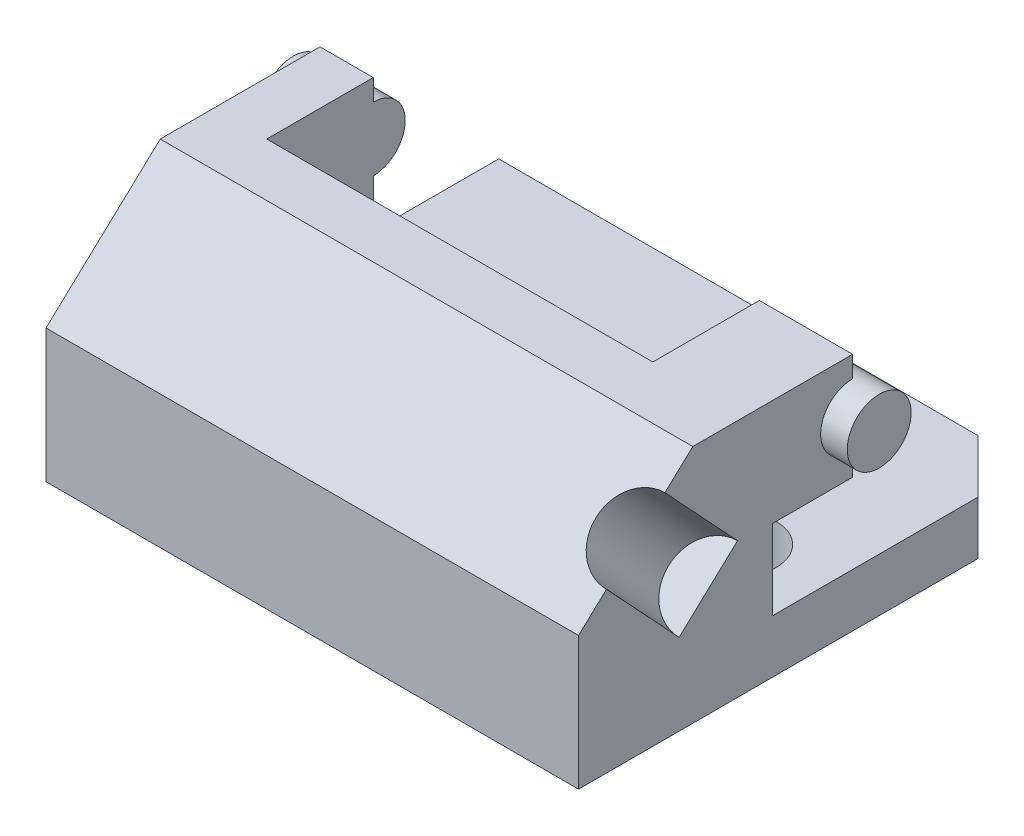
ISO-10303-21;
HEADER;
FILE_DESCRIPTION(('STEP AP214'),'2;1');
FILE_NAME('part.step','',(''),(''),'','','');
FILE_SCHEMA(('AUTOMOTIVE_DESIGN { 1 0 10303 214 1 1 1 1 }'));
ENDSEC;
DATA;
#1=APPLICATION_CONTEXT('core data for automotive mechanical design processes');
#2=APPLICATION_PROTOCOL_DEFINITION('international standard','automotive_design',2000,#1);
#3=PRODUCT_CONTEXT('',#1,'mechanical');
#4=PRODUCT('Part','Part','',(#3));
#5=PRODUCT_RELATED_PRODUCT_CATEGORY('part','',(#4));
#6=PRODUCT_DEFINITION_FORMATION('','',#4);
#7=PRODUCT_DEFINITION_CONTEXT('part definition',#1,'design');
#8=PRODUCT_DEFINITION('design','',#6,#7);
#9=PRODUCT_DEFINITION_SHAPE('','',#8);
#10=(LENGTH_UNIT() NAMED_UNIT(*) SI_UNIT(.MILLI.,.METRE.));
#11=(NAMED_UNIT(*) PLANE_ANGLE_UNIT() SI_UNIT($,.RADIAN.));
#12=(NAMED_UNIT(*) SI_UNIT($,.STERADIAN.) SOLID_ANGLE_UNIT());
#13=UNCERTAINTY_MEASURE_WITH_UNIT(LENGTH_MEASURE(1.E-05),#10,'distance_accuracy_value','');
#14=(GEOMETRIC_REPRESENTATION_CONTEXT(3) GLOBAL_UNCERTAINTY_ASSIGNED_CONTEXT((#13)) GLOBAL_UNIT_ASSIGNED_CONTEXT((#10,
#11,#12)) REPRESENTATION_CONTEXT('',''));
#15=CARTESIAN_POINT('',(0.,0.,0.));
#16=DIRECTION('',(0.,0.,1.));
#17=DIRECTION('',(1.,0.,0.));
#18=AXIS2_PLACEMENT_3D('',#15,#16,#17);
#19=CARTESIAN_POINT('',(100.,25.,-15.));
#20=DIRECTION('',(-1.,0.,0.));
#21=DIRECTION('',(0.,0.,1.));
#22=AXIS2_PLACEMENT_3D('',#19,#20,#21);
#23=CYLINDRICAL_SURFACE('',#22,6.);
#24=CARTESIAN_POINT('',(105.,25.,-15.));
#25=DIRECTION('',(1.,0.,0.));
#26=DIRECTION('',(0.,0.,-1.));
#27=AXIS2_PLACEMENT_3D('',#24,#25,#26);
#28=CIRCLE('',#27,6.00000000000001);
#29=CARTESIAN_POINT('',(105.,25.,-21.));
#30=VERTEX_POINT('',#29);
#31=EDGE_CURVE('E275',#30,#30,#28,.T.);
#32=ORIENTED_EDGE('',*,*,#31,.F.);
#33=EDGE_LOOP('',(#32));
#34=FACE_BOUND('',#33,.T.);
#35=CARTESIAN_POINT('',(82.5,25.,-15.));
#36=DIRECTION('',(-1.,0.,0.));
#37=DIRECTION('',(0.,0.,1.));
#38=AXIS2_PLACEMENT_3D('',#35,#36,#37);
#39=CIRCLE('',#38,6.);
#40=CARTESIAN_POINT('',(82.5,31.,-15.));
#41=VERTEX_POINT('',#40);
#42=CARTESIAN_POINT('',(82.5,19.,-15.));
#43=VERTEX_POINT('',#42);
#44=EDGE_CURVE('E484',#41,#43,#39,.T.);
#45=ORIENTED_EDGE('',*,*,#44,.F.);
#46=DIRECTION('',(-1.,0.,0.));
#47=VECTOR('',#46,1.);
#48=CARTESIAN_POINT('',(100.,31.,-15.));
#49=LINE('',#48,#47);
#50=CARTESIAN_POINT('',(100.,31.,-15.));
#51=VERTEX_POINT('',#50);
#52=EDGE_CURVE('E254',#51,#41,#49,.T.);
#53=ORIENTED_EDGE('',*,*,#52,.F.);
#54=CARTESIAN_POINT('',(100.,25.,-15.));
#55=DIRECTION('',(1.,0.,0.));
#56=DIRECTION('',(0.,0.,-1.));
#57=AXIS2_PLACEMENT_3D('',#54,#55,#56);
#58=CIRCLE('',#57,6.00000000000001);
#59=CARTESIAN_POINT('',(100.,19.,-15.));
#60=VERTEX_POINT('',#59);
#61=EDGE_CURVE('E279',#51,#60,#58,.T.);
#62=ORIENTED_EDGE('',*,*,#61,.T.);
#63=DIRECTION('',(-1.,0.,0.));
#64=VECTOR('',#63,1.);
#65=CARTESIAN_POINT('',(100.,19.,-15.));
#66=LINE('',#65,#64);
#67=EDGE_CURVE('E258',#60,#43,#66,.T.);
#68=ORIENTED_EDGE('',*,*,#67,.T.);
#69=EDGE_LOOP('',(#45,#53,#62,#68));
#70=FACE_BOUND('',#69,.T.);
#71=ADVANCED_FACE('F39',(#34,#70),#23,.T.);
#72=CARTESIAN_POINT('',(-5.,25.,-15.));
#73=DIRECTION('',(-1.,0.,0.));
#74=DIRECTION('',(0.,0.,1.));
#75=AXIS2_PLACEMENT_3D('',#72,#73,#74);
#76=CIRCLE('',#75,6.00000000000001);
#77=CARTESIAN_POINT('',(-5.,25.,-8.99999999999999));
#78=VERTEX_POINT('',#77);
#79=EDGE_CURVE('E273',#78,#78,#76,.T.);
#80=ORIENTED_EDGE('',*,*,#79,.F.);
#81=EDGE_LOOP('',(#80));
#82=FACE_BOUND('',#81,.T.);
#83=CARTESIAN_POINT('',(9.99999999999999,25.,-15.));
#84=DIRECTION('',(1.,0.,0.));
#85=DIRECTION('',(0.,0.,-1.));
#86=AXIS2_PLACEMENT_3D('',#83,#84,#85);
#87=CIRCLE('',#86,6.);
#88=CARTESIAN_POINT('',(10.,19.,-15.));
#89=VERTEX_POINT('',#88);
#90=CARTESIAN_POINT('',(10.,31.,-15.));
#91=VERTEX_POINT('',#90);
#92=EDGE_CURVE('E482',#89,#91,#87,.T.);
#93=ORIENTED_EDGE('',*,*,#92,.F.);
#94=CARTESIAN_POINT('',(0.,19.,-15.));
#95=VERTEX_POINT('',#94);
#96=EDGE_CURVE('E257',#89,#95,#66,.T.);
#97=ORIENTED_EDGE('',*,*,#96,.T.);
#98=CARTESIAN_POINT('',(0.,25.,-15.));
#99=DIRECTION('',(-1.,0.,0.));
#100=DIRECTION('',(0.,0.,1.));
#101=AXIS2_PLACEMENT_3D('',#98,#99,#100);
#102=CIRCLE('',#101,6.00000000000001);
#103=CARTESIAN_POINT('',(0.,31.,-15.));
#104=VERTEX_POINT('',#103);
#105=EDGE_CURVE('E260',#95,#104,#102,.T.);
#106=ORIENTED_EDGE('',*,*,#105,.T.);
#107=EDGE_CURVE('E253',#91,#104,#49,.T.);
#108=ORIENTED_EDGE('',*,*,#107,.F.);
#109=EDGE_LOOP('',(#93,#97,#106,#108));
#110=FACE_BOUND('',#109,.T.);
#111=ADVANCED_FACE('F433',(#82,#110),#23,.T.);
#112=CARTESIAN_POINT('',(100.,0.,-15.));
#113=DIRECTION('',(0.,0.,1.));
#114=DIRECTION('',(0.,-1.,0.));
#115=AXIS2_PLACEMENT_3D('',#112,#113,#114);
#116=PLANE('',#115);
#117=ORIENTED_EDGE('',*,*,#96,.F.);
#118=DIRECTION('',(0.,1.,0.));
#119=VECTOR('',#118,1.);
#120=CARTESIAN_POINT('',(10.,-75.2080447824566,-15.));
#121=LINE('',#120,#119);
#122=CARTESIAN_POINT('',(10.,15.,-15.));
#123=VERTEX_POINT('',#122);
#124=EDGE_CURVE('E354',#123,#89,#121,.T.);
#125=ORIENTED_EDGE('',*,*,#124,.F.);
#126=DIRECTION('',(-1.,0.,0.));
#127=VECTOR('',#126,1.);
#128=CARTESIAN_POINT('',(100.,15.,-15.));
#129=LINE('',#128,#127);
#130=CARTESIAN_POINT('',(0.,15.,-15.));
#131=VERTEX_POINT('',#130);
#132=EDGE_CURVE('E304',#123,#131,#129,.T.);
#133=ORIENTED_EDGE('',*,*,#132,.T.);
#134=DIRECTION('',(0.,1.,0.));
#135=VECTOR('',#134,1.);
#136=CARTESIAN_POINT('',(0.,0.,-15.));
#137=LINE('',#136,#135);
#138=EDGE_CURVE('E278',#131,#95,#137,.T.);
#139=ORIENTED_EDGE('',*,*,#138,.T.);
#140=EDGE_LOOP('',(#117,#125,#133,#139));
#141=FACE_BOUND('',#140,.T.);
#142=ADVANCED_FACE('F351',(#141),#116,.F.);
#143=CARTESIAN_POINT('',(100.,0.,-15.));
#144=DIRECTION('',(0.,0.,1.));
#145=DIRECTION('',(0.,-1.,0.));
#146=AXIS2_PLACEMENT_3D('',#143,#144,#145);
#147=PLANE('',#146);
#148=DIRECTION('',(-1.,0.,0.));
#149=VECTOR('',#148,1.);
#150=CARTESIAN_POINT('',(100.,35.,-15.));
#151=LINE('',#150,#149);
#152=CARTESIAN_POINT('',(10.,35.,-15.));
#153=VERTEX_POINT('',#152);
#154=CARTESIAN_POINT('',(0.,35.,-15.));
#155=VERTEX_POINT('',#154);
#156=EDGE_CURVE('E249',#153,#155,#151,.T.);
#157=ORIENTED_EDGE('',*,*,#156,.F.);
#158=EDGE_CURVE('E357',#91,#153,#121,.T.);
#159=ORIENTED_EDGE('',*,*,#158,.F.);
#160=ORIENTED_EDGE('',*,*,#107,.T.);
#161=DIRECTION('',(0.,1.,0.));
#162=VECTOR('',#161,1.);
#163=CARTESIAN_POINT('',(0.,0.,-15.));
#164=LINE('',#163,#162);
#165=EDGE_CURVE('E307',#104,#155,#164,.T.);
#166=ORIENTED_EDGE('',*,*,#165,.T.);
#167=EDGE_LOOP('',(#157,#159,#160,#166));
#168=FACE_BOUND('',#167,.T.);
#169=ADVANCED_FACE('F446',(#168),#147,.F.);
#170=CARTESIAN_POINT('',(100.,0.,0.));
#171=DIRECTION('',(0.,0.,1.));
#172=DIRECTION('',(1.,0.,0.));
#173=AXIS2_PLACEMENT_3D('',#170,#171,#172);
#174=PLANE('',#173);
#175=DIRECTION('',(-1.,0.,0.));
#176=VECTOR('',#175,1.);
#177=CARTESIAN_POINT('',(100.,15.,0.));
#178=LINE('',#177,#176);
#179=CARTESIAN_POINT('',(10.,15.,0.));
#180=VERTEX_POINT('',#179);
#181=CARTESIAN_POINT('',(0.,15.,0.));
#182=VERTEX_POINT('',#181);
#183=EDGE_CURVE('E331',#180,#182,#178,.T.);
#184=ORIENTED_EDGE('',*,*,#183,.F.);
#185=DIRECTION('',(0.,-1.,0.));
#186=VECTOR('',#185,1.);
#187=CARTESIAN_POINT('',(10.,0.,0.));
#188=LINE('',#187,#186);
#189=CARTESIAN_POINT('',(10.,0.,0.));
#190=VERTEX_POINT('',#189);
#191=EDGE_CURVE('E377',#180,#190,#188,.T.);
#192=ORIENTED_EDGE('',*,*,#191,.T.);
#193=DIRECTION('',(-1.,0.,0.));
#194=VECTOR('',#193,1.);
#195=CARTESIAN_POINT('',(100.,0.,0.));
#196=LINE('',#195,#194);
#197=CARTESIAN_POINT('',(0.,0.,0.));
#198=VERTEX_POINT('',#197);
#199=EDGE_CURVE('E240',#190,#198,#196,.T.);
#200=ORIENTED_EDGE('',*,*,#199,.T.);
#201=DIRECTION('',(0.,1.,0.));
#202=VECTOR('',#201,1.);
#203=CARTESIAN_POINT('',(0.,0.,0.));
#204=LINE('',#203,#202);
#205=EDGE_CURVE('E325',#198,#182,#204,.T.);
#206=ORIENTED_EDGE('',*,*,#205,.T.);
#207=EDGE_LOOP('',(#184,#192,#200,#206));
#208=FACE_BOUND('',#207,.T.);
#209=ADVANCED_FACE('F344',(#208),#174,.F.);
#210=CARTESIAN_POINT('',(100.,15.,0.));
#211=DIRECTION('',(0.,1.,0.));
#212=DIRECTION('',(0.,0.,1.));
#213=AXIS2_PLACEMENT_3D('',#210,#211,#212);
#214=PLANE('',#213);
#215=ORIENTED_EDGE('',*,*,#132,.F.);
#216=DIRECTION('',(0.,0.,1.));
#217=VECTOR('',#216,1.);
#218=CARTESIAN_POINT('',(10.,15.,0.));
#219=LINE('',#218,#217);
#220=EDGE_CURVE('E11',#123,#180,#219,.T.);
#221=ORIENTED_EDGE('',*,*,#220,.T.);
#222=ORIENTED_EDGE('',*,*,#183,.T.);
#223=DIRECTION('',(0.,0.,-1.));
#224=VECTOR('',#223,1.);
#225=CARTESIAN_POINT('',(0.,15.,0.));
#226=LINE('',#225,#224);
#227=EDGE_CURVE('E285',#182,#131,#226,.T.);
#228=ORIENTED_EDGE('',*,*,#227,.T.);
#229=EDGE_LOOP('',(#215,#221,#222,#228));
#230=FACE_BOUND('',#229,.T.);
#231=ADVANCED_FACE('F338',(#230),#214,.F.);
#232=CARTESIAN_POINT('',(100.,15.,-15.));
#233=VERTEX_POINT('',#232);
#234=CARTESIAN_POINT('',(82.5,15.,-15.));
#235=VERTEX_POINT('',#234);
#236=EDGE_CURVE('E330',#233,#235,#129,.T.);
#237=ORIENTED_EDGE('',*,*,#236,.T.);
#238=DIRECTION('',(0.,1.,0.));
#239=VECTOR('',#238,1.);
#240=CARTESIAN_POINT('',(82.5,-75.2080447824566,-15.));
#241=LINE('',#240,#239);
#242=EDGE_CURVE('E361',#235,#43,#241,.T.);
#243=ORIENTED_EDGE('',*,*,#242,.T.);
#244=ORIENTED_EDGE('',*,*,#67,.F.);
#245=DIRECTION('',(0.,1.,0.));
#246=VECTOR('',#245,1.);
#247=CARTESIAN_POINT('',(100.,0.,-15.));
#248=LINE('',#247,#246);
#249=EDGE_CURVE('E282',#233,#60,#248,.T.);
#250=ORIENTED_EDGE('',*,*,#249,.F.);
#251=EDGE_LOOP('',(#237,#243,#244,#250));
#252=FACE_BOUND('',#251,.T.);
#253=ADVANCED_FACE('F41',(#252),#116,.F.);
#254=ORIENTED_EDGE('',*,*,#52,.T.);
#255=CARTESIAN_POINT('',(82.5,35.,-15.));
#256=VERTEX_POINT('',#255);
#257=EDGE_CURVE('E364',#41,#256,#241,.T.);
#258=ORIENTED_EDGE('',*,*,#257,.T.);
#259=CARTESIAN_POINT('',(100.,35.,-15.));
#260=VERTEX_POINT('',#259);
#261=EDGE_CURVE('E250',#260,#256,#151,.T.);
#262=ORIENTED_EDGE('',*,*,#261,.F.);
#263=DIRECTION('',(0.,1.,0.));
#264=VECTOR('',#263,1.);
#265=CARTESIAN_POINT('',(100.,0.,-15.));
#266=LINE('',#265,#264);
#267=EDGE_CURVE('E284',#51,#260,#266,.T.);
#268=ORIENTED_EDGE('',*,*,#267,.F.);
#269=EDGE_LOOP('',(#254,#258,#262,#268));
#270=FACE_BOUND('',#269,.T.);
#271=ADVANCED_FACE('F442',(#270),#147,.F.);
#272=CARTESIAN_POINT('',(100.,35.,0.));
#273=DIRECTION('',(0.,1.,0.));
#274=DIRECTION('',(0.,0.,1.));
#275=AXIS2_PLACEMENT_3D('',#272,#273,#274);
#276=PLANE('',#275);
#277=DIRECTION('',(0.,0.,1.));
#278=VECTOR('',#277,1.);
#279=CARTESIAN_POINT('',(10.,35.,0.));
#280=LINE('',#279,#278);
#281=CARTESIAN_POINT('',(10.,35.,5.00000000000001));
#282=VERTEX_POINT('',#281);
#283=EDGE_CURVE('E370',#153,#282,#280,.T.);
#284=ORIENTED_EDGE('',*,*,#283,.F.);
#285=ORIENTED_EDGE('',*,*,#156,.T.);
#286=DIRECTION('',(0.,0.,-1.));
#287=VECTOR('',#286,1.);
#288=CARTESIAN_POINT('',(0.,35.,0.));
#289=LINE('',#288,#287);
#290=CARTESIAN_POINT('',(0.,35.,15.));
#291=VERTEX_POINT('',#290);
#292=EDGE_CURVE('E310',#291,#155,#289,.T.);
#293=ORIENTED_EDGE('',*,*,#292,.F.);
#294=DIRECTION('',(-1.,0.,0.));
#295=VECTOR('',#294,1.);
#296=CARTESIAN_POINT('',(100.,35.,15.));
#297=LINE('',#296,#295);
#298=CARTESIAN_POINT('',(100.,35.,15.));
#299=VERTEX_POINT('',#298);
#300=EDGE_CURVE('E247',#299,#291,#297,.T.);
#301=ORIENTED_EDGE('',*,*,#300,.F.);
#302=DIRECTION('',(0.,0.,-1.));
#303=VECTOR('',#302,1.);
#304=CARTESIAN_POINT('',(100.,35.,0.));
#305=LINE('',#304,#303);
#306=EDGE_CURVE('E287',#299,#260,#305,.T.);
#307=ORIENTED_EDGE('',*,*,#306,.T.);
#308=ORIENTED_EDGE('',*,*,#261,.T.);
#309=DIRECTION('',(0.,0.,-1.));
#310=VECTOR('',#309,1.);
#311=CARTESIAN_POINT('',(82.5,35.,0.));
#312=LINE('',#311,#310);
#313=CARTESIAN_POINT('',(82.5,35.,5.00000000000001));
#314=VERTEX_POINT('',#313);
#315=EDGE_CURVE('E498',#314,#256,#312,.T.);
#316=ORIENTED_EDGE('',*,*,#315,.F.);
#317=DIRECTION('',(1.,0.,0.));
#318=VECTOR('',#317,1.);
#319=CARTESIAN_POINT('',(0.,35.,5.00000000000001));
#320=LINE('',#319,#318);
#321=EDGE_CURVE('E487',#282,#314,#320,.T.);
#322=ORIENTED_EDGE('',*,*,#321,.F.);
#323=EDGE_LOOP('',(#284,#285,#293,#301,#307,#308,#316,#322));
#324=FACE_BOUND('',#323,.T.);
#325=ADVANCED_FACE('F407',(#324),#276,.T.);
#326=CARTESIAN_POINT('',(100.,26.2024686674709,24.434197326466));
#327=DIRECTION('',(0.,0.731353701619172,0.681998360062497));
#328=DIRECTION('',(0.,-0.681998360062497,0.731353701619172));
#329=AXIS2_PLACEMENT_3D('',#326,#327,#328);
#330=PLANE('',#329);
#331=CARTESIAN_POINT('',(100.,25.,25.7236871002469));
#332=DIRECTION('',(0.,0.731353701619172,0.681998360062497));
#333=DIRECTION('',(0.,-0.681998360062497,0.731353701619172));
#334=AXIS2_PLACEMENT_3D('',#331,#332,#333);
#335=CIRCLE('',#334,7.50000000000001);
#336=CARTESIAN_POINT('',(100.,30.1149877004687,20.2385343381031));
#337=VERTEX_POINT('',#336);
#338=CARTESIAN_POINT('',(100.,19.8850122995313,31.2088398623907));
#339=VERTEX_POINT('',#338);
#340=EDGE_CURVE('E379',#337,#339,#335,.T.);
#341=ORIENTED_EDGE('',*,*,#340,.F.);
#342=DIRECTION('',(0.,0.681998360062497,-0.731353701619171));
#343=VECTOR('',#342,1.);
#344=CARTESIAN_POINT('',(100.,26.2024686674709,24.434197326466));
#345=LINE('',#344,#343);
#346=EDGE_CURVE('E290',#337,#299,#345,.T.);
#347=ORIENTED_EDGE('',*,*,#346,.T.);
#348=ORIENTED_EDGE('',*,*,#300,.T.);
#349=DIRECTION('',(0.,0.681998360062497,-0.731353701619171));
#350=VECTOR('',#349,1.);
#351=CARTESIAN_POINT('',(0.,26.2024686674709,24.434197326466));
#352=LINE('',#351,#350);
#353=CARTESIAN_POINT('',(0.,15.,36.4473742004937));
#354=VERTEX_POINT('',#353);
#355=EDGE_CURVE('E313',#354,#291,#352,.T.);
#356=ORIENTED_EDGE('',*,*,#355,.F.);
#357=DIRECTION('',(-1.,0.,0.));
#358=VECTOR('',#357,1.);
#359=CARTESIAN_POINT('',(100.,15.,36.4473742004937));
#360=LINE('',#359,#358);
#361=CARTESIAN_POINT('',(100.,15.,36.4473742004937));
#362=VERTEX_POINT('',#361);
#363=EDGE_CURVE('E245',#362,#354,#360,.T.);
#364=ORIENTED_EDGE('',*,*,#363,.F.);
#365=EDGE_CURVE('E291',#362,#339,#345,.T.);
#366=ORIENTED_EDGE('',*,*,#365,.T.);
#367=EDGE_LOOP('',(#341,#347,#348,#356,#364,#366));
#368=FACE_BOUND('',#367,.T.);
#369=ADVANCED_FACE('F398',(#368),#330,.T.);
#370=CARTESIAN_POINT('',(100.,0.,36.4473742004937));
#371=DIRECTION('',(0.,0.,1.));
#372=DIRECTION('',(1.,0.,0.));
#373=AXIS2_PLACEMENT_3D('',#370,#371,#372);
#374=PLANE('',#373);
#375=DIRECTION('',(0.,1.,0.));
#376=VECTOR('',#375,1.);
#377=CARTESIAN_POINT('',(0.,0.,36.4473742004937));
#378=LINE('',#377,#376);
#379=CARTESIAN_POINT('',(0.,-10.,36.4473742004937));
#380=VERTEX_POINT('',#379);
#381=EDGE_CURVE('E316',#380,#354,#378,.T.);
#382=ORIENTED_EDGE('',*,*,#381,.F.);
#383=DIRECTION('',(-1.,0.,0.));
#384=VECTOR('',#383,1.);
#385=CARTESIAN_POINT('',(100.,-10.,36.4473742004937));
#386=LINE('',#385,#384);
#387=CARTESIAN_POINT('',(100.,-10.,36.4473742004937));
#388=VERTEX_POINT('',#387);
#389=EDGE_CURVE('E237',#388,#380,#386,.T.);
#390=ORIENTED_EDGE('',*,*,#389,.F.);
#391=DIRECTION('',(0.,1.,0.));
#392=VECTOR('',#391,1.);
#393=CARTESIAN_POINT('',(100.,0.,36.4473742004937));
#394=LINE('',#393,#392);
#395=EDGE_CURVE('E294',#388,#362,#394,.T.);
#396=ORIENTED_EDGE('',*,*,#395,.T.);
#397=ORIENTED_EDGE('',*,*,#363,.T.);
#398=EDGE_LOOP('',(#382,#390,#396,#397));
#399=FACE_BOUND('',#398,.T.);
#400=ADVANCED_FACE('F415',(#399),#374,.T.);
#401=CARTESIAN_POINT('',(100.,-10.,0.));
#402=DIRECTION('',(0.,-1.,0.));
#403=DIRECTION('',(0.,0.,-1.));
#404=AXIS2_PLACEMENT_3D('',#401,#402,#403);
#405=PLANE('',#404);
#406=DIRECTION('',(-0.707106781186544,0.,-0.707106781186551));
#407=VECTOR('',#406,1.);
#408=CARTESIAN_POINT('',(100.,-10.,-38.5526257995063));
#409=LINE('',#408,#407);
#410=CARTESIAN_POINT('',(100.,-10.,-38.5526257995063));
#411=VERTEX_POINT('',#410);
#412=CARTESIAN_POINT('',(90.0000000000001,-10.,-48.5526257995063));
#413=VERTEX_POINT('',#412);
#414=EDGE_CURVE('E213',#411,#413,#409,.T.);
#415=ORIENTED_EDGE('',*,*,#414,.F.);
#416=DIRECTION('',(0.,0.,1.));
#417=VECTOR('',#416,1.);
#418=CARTESIAN_POINT('',(100.,-10.,0.));
#419=LINE('',#418,#417);
#420=EDGE_CURVE('E297',#411,#388,#419,.T.);
#421=ORIENTED_EDGE('',*,*,#420,.T.);
#422=ORIENTED_EDGE('',*,*,#389,.T.);
#423=DIRECTION('',(0.,0.,1.));
#424=VECTOR('',#423,1.);
#425=CARTESIAN_POINT('',(0.,-10.,0.));
#426=LINE('',#425,#424);
#427=CARTESIAN_POINT('',(0.,-10.,-48.5526257995063));
#428=VERTEX_POINT('',#427);
#429=EDGE_CURVE('E319',#428,#380,#426,.T.);
#430=ORIENTED_EDGE('',*,*,#429,.F.);
#431=DIRECTION('',(-1.,0.,0.));
#432=VECTOR('',#431,1.);
#433=CARTESIAN_POINT('',(100.,-10.,-48.5526257995063));
#434=LINE('',#433,#432);
#435=EDGE_CURVE('E234',#413,#428,#434,.T.);
#436=ORIENTED_EDGE('',*,*,#435,.F.);
#437=EDGE_LOOP('',(#415,#421,#422,#430,#436));
#438=FACE_BOUND('',#437,.T.);
#439=CARTESIAN_POINT('',(15.,-10.,-8.14899713183087));
#440=DIRECTION('',(0.,-1.,0.));
#441=DIRECTION('',(0.,0.,-1.));
#442=AXIS2_PLACEMENT_3D('',#439,#440,#441);
#443=CIRCLE('',#442,7.5);
#444=CARTESIAN_POINT('',(15.,-10.,-15.6489971318309));
#445=VERTEX_POINT('',#444);
#446=EDGE_CURVE('E490',#445,#445,#443,.T.);
#447=ORIENTED_EDGE('',*,*,#446,.F.);
#448=EDGE_LOOP('',(#447));
#449=FACE_BOUND('',#448,.T.);
#450=CARTESIAN_POINT('',(35.,-10.,-8.14899713183087));
#451=DIRECTION('',(0.,-1.,0.));
#452=DIRECTION('',(0.,0.,-1.));
#453=AXIS2_PLACEMENT_3D('',#450,#451,#452);
#454=CIRCLE('',#453,7.5);
#455=CARTESIAN_POINT('',(35.,-10.,-0.648997131830871));
#456=VERTEX_POINT('',#455);
#457=CARTESIAN_POINT('',(35.,-10.,-15.6489971318309));
#458=VERTEX_POINT('',#457);
#459=EDGE_CURVE('E62',#456,#458,#454,.T.);
#460=ORIENTED_EDGE('',*,*,#459,.F.);
#461=DIRECTION('',(1.,0.,0.));
#462=VECTOR('',#461,1.);
#463=CARTESIAN_POINT('',(0.,-10.,-0.648997131830871));
#464=LINE('',#463,#462);
#465=CARTESIAN_POINT('',(65.,-10.,-0.648997131830871));
#466=VERTEX_POINT('',#465);
#467=EDGE_CURVE('E522',#456,#466,#464,.T.);
#468=ORIENTED_EDGE('',*,*,#467,.T.);
#469=CARTESIAN_POINT('',(65.,-10.,-8.14899713183087));
#470=DIRECTION('',(0.,-1.,0.));
#471=DIRECTION('',(0.,0.,-1.));
#472=AXIS2_PLACEMENT_3D('',#469,#470,#471);
#473=CIRCLE('',#472,7.5);
#474=CARTESIAN_POINT('',(65.,-10.,-15.6489971318309));
#475=VERTEX_POINT('',#474);
#476=EDGE_CURVE('E536',#475,#466,#473,.T.);
#477=ORIENTED_EDGE('',*,*,#476,.F.);
#478=DIRECTION('',(1.,0.,0.));
#479=VECTOR('',#478,1.);
#480=CARTESIAN_POINT('',(0.,-10.,-15.6489971318309));
#481=LINE('',#480,#479);
#482=EDGE_CURVE('E532',#458,#475,#481,.T.);
#483=ORIENTED_EDGE('',*,*,#482,.F.);
#484=EDGE_LOOP('',(#460,#468,#477,#483));
#485=FACE_BOUND('',#484,.T.);
#486=CARTESIAN_POINT('',(85.,-10.,-8.14899713183087));
#487=DIRECTION('',(0.,-1.,0.));
#488=DIRECTION('',(0.,0.,-1.));
#489=AXIS2_PLACEMENT_3D('',#486,#487,#488);
#490=CIRCLE('',#489,7.5);
#491=CARTESIAN_POINT('',(85.,-10.,-15.6489971318309));
#492=VERTEX_POINT('',#491);
#493=EDGE_CURVE('E217',#492,#492,#490,.T.);
#494=ORIENTED_EDGE('',*,*,#493,.F.);
#495=EDGE_LOOP('',(#494));
#496=FACE_BOUND('',#495,.T.);
#497=ADVANCED_FACE('F453',(#438,#449,#485,#496),#405,.T.);
#498=CARTESIAN_POINT('',(100.,0.,-48.5526257995063));
#499=DIRECTION('',(0.,0.,-1.));
#500=DIRECTION('',(0.,1.,0.));
#501=AXIS2_PLACEMENT_3D('',#498,#499,#500);
#502=PLANE('',#501);
#503=DIRECTION('',(0.,-1.,0.));
#504=VECTOR('',#503,1.);
#505=CARTESIAN_POINT('',(90.0000000000001,0.,-48.5526257995063));
#506=LINE('',#505,#504);
#507=CARTESIAN_POINT('',(90.0000000000001,0.,-48.5526257995063));
#508=VERTEX_POINT('',#507);
#509=EDGE_CURVE('E210',#508,#413,#506,.T.);
#510=ORIENTED_EDGE('',*,*,#509,.T.);
#511=ORIENTED_EDGE('',*,*,#435,.T.);
#512=DIRECTION('',(0.,-1.,0.));
#513=VECTOR('',#512,1.);
#514=CARTESIAN_POINT('',(0.,0.,-48.5526257995063));
#515=LINE('',#514,#513);
#516=CARTESIAN_POINT('',(0.,0.,-48.5526257995063));
#517=VERTEX_POINT('',#516);
#518=EDGE_CURVE('E232',#517,#428,#515,.T.);
#519=ORIENTED_EDGE('',*,*,#518,.F.);
#520=DIRECTION('',(-1.,0.,0.));
#521=VECTOR('',#520,1.);
#522=CARTESIAN_POINT('',(100.,0.,-48.5526257995063));
#523=LINE('',#522,#521);
#524=EDGE_CURVE('E225',#508,#517,#523,.T.);
#525=ORIENTED_EDGE('',*,*,#524,.F.);
#526=EDGE_LOOP('',(#510,#511,#519,#525));
#527=FACE_BOUND('',#526,.T.);
#528=ADVANCED_FACE('F230',(#527),#502,.T.);
#529=CARTESIAN_POINT('',(100.,0.,0.));
#530=DIRECTION('',(0.,1.,0.));
#531=DIRECTION('',(0.,0.,1.));
#532=AXIS2_PLACEMENT_3D('',#529,#530,#531);
#533=PLANE('',#532);
#534=DIRECTION('',(-0.707106781186544,0.,-0.707106781186551));
#535=VECTOR('',#534,1.);
#536=CARTESIAN_POINT('',(100.,0.,-38.5526257995063));
#537=LINE('',#536,#535);
#538=CARTESIAN_POINT('',(100.,0.,-38.5526257995063));
#539=VERTEX_POINT('',#538);
#540=EDGE_CURVE('E54',#539,#508,#537,.T.);
#541=ORIENTED_EDGE('',*,*,#540,.T.);
#542=ORIENTED_EDGE('',*,*,#524,.T.);
#543=DIRECTION('',(0.,0.,-1.));
#544=VECTOR('',#543,1.);
#545=CARTESIAN_POINT('',(0.,0.,0.));
#546=LINE('',#545,#544);
#547=EDGE_CURVE('E323',#198,#517,#546,.T.);
#548=ORIENTED_EDGE('',*,*,#547,.F.);
#549=ORIENTED_EDGE('',*,*,#199,.F.);
#550=DIRECTION('',(0.,0.,-1.));
#551=VECTOR('',#550,1.);
#552=CARTESIAN_POINT('',(10.,0.,0.));
#553=LINE('',#552,#551);
#554=CARTESIAN_POINT('',(10.,0.,5.00000000000001));
#555=VERTEX_POINT('',#554);
#556=EDGE_CURVE('E359',#555,#190,#553,.T.);
#557=ORIENTED_EDGE('',*,*,#556,.F.);
#558=DIRECTION('',(-1.,0.,0.));
#559=VECTOR('',#558,1.);
#560=CARTESIAN_POINT('',(0.,0.,5.00000000000001));
#561=LINE('',#560,#559);
#562=CARTESIAN_POINT('',(82.5,0.,5.00000000000001));
#563=VERTEX_POINT('',#562);
#564=EDGE_CURVE('E374',#563,#555,#561,.T.);
#565=ORIENTED_EDGE('',*,*,#564,.F.);
#566=DIRECTION('',(0.,0.,1.));
#567=VECTOR('',#566,1.);
#568=CARTESIAN_POINT('',(82.5,0.,0.));
#569=LINE('',#568,#567);
#570=CARTESIAN_POINT('',(82.5,0.,0.));
#571=VERTEX_POINT('',#570);
#572=EDGE_CURVE('E371',#571,#563,#569,.T.);
#573=ORIENTED_EDGE('',*,*,#572,.F.);
#574=CARTESIAN_POINT('',(100.,0.,0.));
#575=VERTEX_POINT('',#574);
#576=EDGE_CURVE('E235',#575,#571,#196,.T.);
#577=ORIENTED_EDGE('',*,*,#576,.F.);
#578=DIRECTION('',(0.,0.,-1.));
#579=VECTOR('',#578,1.);
#580=CARTESIAN_POINT('',(100.,0.,0.));
#581=LINE('',#580,#579);
#582=EDGE_CURVE('E228',#575,#539,#581,.T.);
#583=ORIENTED_EDGE('',*,*,#582,.T.);
#584=EDGE_LOOP('',(#541,#542,#548,#549,#557,#565,#573,#577,#583));
#585=FACE_BOUND('',#584,.T.);
#586=CARTESIAN_POINT('',(15.,0.,-8.14899713183087));
#587=DIRECTION('',(0.,-1.,0.));
#588=DIRECTION('',(0.,0.,-1.));
#589=AXIS2_PLACEMENT_3D('',#586,#587,#588);
#590=CIRCLE('',#589,7.5);
#591=CARTESIAN_POINT('',(15.,0.,-15.6489971318309));
#592=VERTEX_POINT('',#591);
#593=EDGE_CURVE('E485',#592,#592,#590,.T.);
#594=ORIENTED_EDGE('',*,*,#593,.T.);
#595=EDGE_LOOP('',(#594));
#596=FACE_BOUND('',#595,.T.);
#597=CARTESIAN_POINT('',(35.,0.,-8.14899713183087));
#598=DIRECTION('',(0.,-1.,0.));
#599=DIRECTION('',(0.,0.,-1.));
#600=AXIS2_PLACEMENT_3D('',#597,#598,#599);
#601=CIRCLE('',#600,7.5);
#602=CARTESIAN_POINT('',(35.,0.,-0.648997131830867));
#603=VERTEX_POINT('',#602);
#604=CARTESIAN_POINT('',(35.,0.,-15.6489971318309));
#605=VERTEX_POINT('',#604);
#606=EDGE_CURVE('E518',#603,#605,#601,.T.);
#607=ORIENTED_EDGE('',*,*,#606,.T.);
#608=DIRECTION('',(1.,0.,0.));
#609=VECTOR('',#608,1.);
#610=CARTESIAN_POINT('',(0.,0.,-15.6489971318309));
#611=LINE('',#610,#609);
#612=CARTESIAN_POINT('',(65.,0.,-15.6489971318309));
#613=VERTEX_POINT('',#612);
#614=EDGE_CURVE('E521',#605,#613,#611,.T.);
#615=ORIENTED_EDGE('',*,*,#614,.T.);
#616=CARTESIAN_POINT('',(65.,0.,-8.14899713183087));
#617=DIRECTION('',(0.,-1.,0.));
#618=DIRECTION('',(0.,0.,-1.));
#619=AXIS2_PLACEMENT_3D('',#616,#617,#618);
#620=CIRCLE('',#619,7.5);
#621=CARTESIAN_POINT('',(65.,0.,-0.648997131830867));
#622=VERTEX_POINT('',#621);
#623=EDGE_CURVE('E525',#613,#622,#620,.T.);
#624=ORIENTED_EDGE('',*,*,#623,.T.);
#625=DIRECTION('',(1.,0.,0.));
#626=VECTOR('',#625,1.);
#627=CARTESIAN_POINT('',(0.,0.,-0.648997131830867));
#628=LINE('',#627,#626);
#629=EDGE_CURVE('E528',#603,#622,#628,.T.);
#630=ORIENTED_EDGE('',*,*,#629,.F.);
#631=EDGE_LOOP('',(#607,#615,#624,#630));
#632=FACE_BOUND('',#631,.T.);
#633=CARTESIAN_POINT('',(85.,0.,-8.14899713183087));
#634=DIRECTION('',(0.,-1.,0.));
#635=DIRECTION('',(0.,0.,-1.));
#636=AXIS2_PLACEMENT_3D('',#633,#634,#635);
#637=CIRCLE('',#636,7.5);
#638=CARTESIAN_POINT('',(85.,0.,-15.6489971318309));
#639=VERTEX_POINT('',#638);
#640=EDGE_CURVE('E533',#639,#639,#637,.T.);
#641=ORIENTED_EDGE('',*,*,#640,.T.);
#642=EDGE_LOOP('',(#641));
#643=FACE_BOUND('',#642,.T.);
#644=ADVANCED_FACE('F222',(#585,#596,#632,#643),#533,.T.);
#645=ORIENTED_EDGE('',*,*,#576,.T.);
#646=DIRECTION('',(0.,1.,0.));
#647=VECTOR('',#646,1.);
#648=CARTESIAN_POINT('',(82.5,0.,0.));
#649=LINE('',#648,#647);
#650=CARTESIAN_POINT('',(82.5,15.,0.));
#651=VERTEX_POINT('',#650);
#652=EDGE_CURVE('E373',#571,#651,#649,.T.);
#653=ORIENTED_EDGE('',*,*,#652,.T.);
#654=CARTESIAN_POINT('',(100.,15.,0.));
#655=VERTEX_POINT('',#654);
#656=EDGE_CURVE('E332',#655,#651,#178,.T.);
#657=ORIENTED_EDGE('',*,*,#656,.F.);
#658=DIRECTION('',(0.,1.,0.));
#659=VECTOR('',#658,1.);
#660=CARTESIAN_POINT('',(100.,0.,0.));
#661=LINE('',#660,#659);
#662=EDGE_CURVE('E300',#575,#655,#661,.T.);
#663=ORIENTED_EDGE('',*,*,#662,.F.);
#664=EDGE_LOOP('',(#645,#653,#657,#663));
#665=FACE_BOUND('',#664,.T.);
#666=ADVANCED_FACE('F461',(#665),#174,.F.);
#667=ORIENTED_EDGE('',*,*,#656,.T.);
#668=DIRECTION('',(0.,0.,-1.));
#669=VECTOR('',#668,1.);
#670=CARTESIAN_POINT('',(82.5,15.,0.));
#671=LINE('',#670,#669);
#672=EDGE_CURVE('E47',#651,#235,#671,.T.);
#673=ORIENTED_EDGE('',*,*,#672,.T.);
#674=ORIENTED_EDGE('',*,*,#236,.F.);
#675=DIRECTION('',(0.,0.,-1.));
#676=VECTOR('',#675,1.);
#677=CARTESIAN_POINT('',(100.,15.,0.));
#678=LINE('',#677,#676);
#679=EDGE_CURVE('E302',#655,#233,#678,.T.);
#680=ORIENTED_EDGE('',*,*,#679,.F.);
#681=EDGE_LOOP('',(#667,#673,#674,#680));
#682=FACE_BOUND('',#681,.T.);
#683=ADVANCED_FACE('F464',(#682),#214,.F.);
#684=CARTESIAN_POINT('',(100.,0.,0.));
#685=DIRECTION('',(1.,0.,0.));
#686=DIRECTION('',(0.,0.,-1.));
#687=AXIS2_PLACEMENT_3D('',#684,#685,#686);
#688=PLANE('',#687);
#689=DIRECTION('',(0.,-1.,0.));
#690=VECTOR('',#689,1.);
#691=CARTESIAN_POINT('',(100.,0.,-38.5526257995063));
#692=LINE('',#691,#690);
#693=EDGE_CURVE('E218',#539,#411,#692,.T.);
#694=ORIENTED_EDGE('',*,*,#693,.F.);
#695=ORIENTED_EDGE('',*,*,#582,.F.);
#696=ORIENTED_EDGE('',*,*,#662,.T.);
#697=ORIENTED_EDGE('',*,*,#679,.T.);
#698=ORIENTED_EDGE('',*,*,#249,.T.);
#699=ORIENTED_EDGE('',*,*,#61,.F.);
#700=ORIENTED_EDGE('',*,*,#267,.T.);
#701=ORIENTED_EDGE('',*,*,#306,.F.);
#702=ORIENTED_EDGE('',*,*,#346,.F.);
#703=DIRECTION('',(0.,0.731353701619172,0.681998360062497));
#704=VECTOR('',#703,1.);
#705=CARTESIAN_POINT('',(100.,15.4879136680853,6.59856713685314));
#706=LINE('',#705,#704);
#707=CARTESIAN_POINT('',(100.,15.4879136680853,6.59856713685314));
#708=VERTEX_POINT('',#707);
#709=EDGE_CURVE('E384',#708,#337,#706,.T.);
#710=ORIENTED_EDGE('',*,*,#709,.F.);
#711=DIRECTION('',(0.,0.681998360062497,-0.731353701619172));
#712=VECTOR('',#711,1.);
#713=CARTESIAN_POINT('',(100.,11.5753946350875,10.794230125216));
#714=LINE('',#713,#712);
#715=CARTESIAN_POINT('',(100.,5.25793826714784,17.5688726611407));
#716=VERTEX_POINT('',#715);
#717=EDGE_CURVE('E380',#716,#708,#714,.T.);
#718=ORIENTED_EDGE('',*,*,#717,.F.);
#719=DIRECTION('',(0.,0.731353701619172,0.681998360062497));
#720=VECTOR('',#719,1.);
#721=CARTESIAN_POINT('',(100.,5.25793826714784,17.5688726611407));
#722=LINE('',#721,#720);
#723=EDGE_CURVE('E386',#716,#339,#722,.T.);
#724=ORIENTED_EDGE('',*,*,#723,.T.);
#725=ORIENTED_EDGE('',*,*,#365,.F.);
#726=ORIENTED_EDGE('',*,*,#395,.F.);
#727=ORIENTED_EDGE('',*,*,#420,.F.);
#728=EDGE_LOOP('',(#694,#695,#696,#697,#698,#699,#700,#701,#702,#710,#718,#724,#725,#726,#727));
#729=FACE_BOUND('',#728,.T.);
#730=ADVANCED_FACE('F402',(#729),#688,.T.);
#731=CARTESIAN_POINT('',(0.,0.,0.));
#732=DIRECTION('',(1.,0.,0.));
#733=DIRECTION('',(0.,0.,-1.));
#734=AXIS2_PLACEMENT_3D('',#731,#732,#733);
#735=PLANE('',#734);
#736=ORIENTED_EDGE('',*,*,#105,.F.);
#737=ORIENTED_EDGE('',*,*,#138,.F.);
#738=ORIENTED_EDGE('',*,*,#227,.F.);
#739=ORIENTED_EDGE('',*,*,#205,.F.);
#740=ORIENTED_EDGE('',*,*,#547,.T.);
#741=ORIENTED_EDGE('',*,*,#518,.T.);
#742=ORIENTED_EDGE('',*,*,#429,.T.);
#743=ORIENTED_EDGE('',*,*,#381,.T.);
#744=ORIENTED_EDGE('',*,*,#355,.T.);
#745=ORIENTED_EDGE('',*,*,#292,.T.);
#746=ORIENTED_EDGE('',*,*,#165,.F.);
#747=EDGE_LOOP('',(#736,#737,#738,#739,#740,#741,#742,#743,#744,#745,#746));
#748=FACE_BOUND('',#747,.T.);
#749=ADVANCED_FACE('F347',(#748),#735,.F.);
#750=CARTESIAN_POINT('',(105.,25.,-15.));
#751=DIRECTION('',(1.,0.,0.));
#752=DIRECTION('',(0.,0.,-1.));
#753=AXIS2_PLACEMENT_3D('',#750,#751,#752);
#754=PLANE('',#753);
#755=ORIENTED_EDGE('',*,*,#31,.T.);
#756=EDGE_LOOP('',(#755));
#757=FACE_BOUND('',#756,.T.);
#758=ADVANCED_FACE('F470',(#757),#754,.T.);
#759=CARTESIAN_POINT('',(-5.,25.,-15.));
#760=DIRECTION('',(-1.,0.,0.));
#761=DIRECTION('',(0.,0.,1.));
#762=AXIS2_PLACEMENT_3D('',#759,#760,#761);
#763=PLANE('',#762);
#764=ORIENTED_EDGE('',*,*,#79,.T.);
#765=EDGE_LOOP('',(#764));
#766=FACE_BOUND('',#765,.T.);
#767=ADVANCED_FACE('F429',(#766),#763,.T.);
#768=CARTESIAN_POINT('',(100.,10.3729259676166,12.0837198989969));
#769=DIRECTION('',(0.,0.731353701619172,0.681998360062497));
#770=DIRECTION('',(0.,-0.681998360062497,0.731353701619172));
#771=AXIS2_PLACEMENT_3D('',#768,#769,#770);
#772=CYLINDRICAL_SURFACE('',#771,7.50000000000001);
#773=ORIENTED_EDGE('',*,*,#340,.T.);
#774=ORIENTED_EDGE('',*,*,#723,.F.);
#775=CARTESIAN_POINT('',(100.,10.3729259676166,12.0837198989969));
#776=DIRECTION('',(0.,0.731353701619172,0.681998360062497));
#777=DIRECTION('',(0.,-0.681998360062497,0.731353701619172));
#778=AXIS2_PLACEMENT_3D('',#775,#776,#777);
#779=CIRCLE('',#778,7.50000000000001);
#780=EDGE_CURVE('E382',#708,#716,#779,.T.);
#781=ORIENTED_EDGE('',*,*,#780,.F.);
#782=ORIENTED_EDGE('',*,*,#709,.T.);
#783=EDGE_LOOP('',(#773,#774,#781,#782));
#784=FACE_BOUND('',#783,.T.);
#785=ADVANCED_FACE('F392',(#784),#772,.F.);
#786=CARTESIAN_POINT('',(0.,11.5753946350875,10.794230125216));
#787=DIRECTION('',(0.,0.731353701619172,0.681998360062497));
#788=DIRECTION('',(0.,-0.681998360062497,0.731353701619172));
#789=AXIS2_PLACEMENT_3D('',#786,#787,#788);
#790=PLANE('',#789);
#791=ORIENTED_EDGE('',*,*,#717,.T.);
#792=ORIENTED_EDGE('',*,*,#780,.T.);
#793=EDGE_LOOP('',(#791,#792));
#794=FACE_BOUND('',#793,.T.);
#795=ADVANCED_FACE('F419',(#794),#790,.T.);
#796=CARTESIAN_POINT('',(10.,-75.2080447824566,0.));
#797=DIRECTION('',(-1.,0.,0.));
#798=DIRECTION('',(0.,0.,1.));
#799=AXIS2_PLACEMENT_3D('',#796,#797,#798);
#800=PLANE('',#799);
#801=ORIENTED_EDGE('',*,*,#220,.F.);
#802=ORIENTED_EDGE('',*,*,#124,.T.);
#803=ORIENTED_EDGE('',*,*,#92,.T.);
#804=ORIENTED_EDGE('',*,*,#158,.T.);
#805=ORIENTED_EDGE('',*,*,#283,.T.);
#806=DIRECTION('',(0.,1.,0.));
#807=VECTOR('',#806,1.);
#808=CARTESIAN_POINT('',(10.,-75.2080447824566,5.00000000000001));
#809=LINE('',#808,#807);
#810=EDGE_CURVE('E356',#555,#282,#809,.T.);
#811=ORIENTED_EDGE('',*,*,#810,.F.);
#812=ORIENTED_EDGE('',*,*,#556,.T.);
#813=ORIENTED_EDGE('',*,*,#191,.F.);
#814=EDGE_LOOP('',(#801,#802,#803,#804,#805,#811,#812,#813));
#815=FACE_BOUND('',#814,.T.);
#816=ADVANCED_FACE('F421',(#815),#800,.F.);
#817=CARTESIAN_POINT('',(82.5,-75.2080447824566,0.));
#818=DIRECTION('',(1.,0.,0.));
#819=DIRECTION('',(0.,0.,-1.));
#820=AXIS2_PLACEMENT_3D('',#817,#818,#819);
#821=PLANE('',#820);
#822=ORIENTED_EDGE('',*,*,#572,.T.);
#823=DIRECTION('',(0.,1.,0.));
#824=VECTOR('',#823,1.);
#825=CARTESIAN_POINT('',(82.5,-75.2080447824566,5.00000000000001));
#826=LINE('',#825,#824);
#827=EDGE_CURVE('E367',#563,#314,#826,.T.);
#828=ORIENTED_EDGE('',*,*,#827,.T.);
#829=ORIENTED_EDGE('',*,*,#315,.T.);
#830=ORIENTED_EDGE('',*,*,#257,.F.);
#831=ORIENTED_EDGE('',*,*,#44,.T.);
#832=ORIENTED_EDGE('',*,*,#242,.F.);
#833=ORIENTED_EDGE('',*,*,#672,.F.);
#834=ORIENTED_EDGE('',*,*,#652,.F.);
#835=EDGE_LOOP('',(#822,#828,#829,#830,#831,#832,#833,#834));
#836=FACE_BOUND('',#835,.T.);
#837=ADVANCED_FACE('F427',(#836),#821,.F.);
#838=CARTESIAN_POINT('',(0.,-75.2080447824566,5.00000000000001));
#839=DIRECTION('',(0.,0.,1.));
#840=DIRECTION('',(1.,0.,0.));
#841=AXIS2_PLACEMENT_3D('',#838,#839,#840);
#842=PLANE('',#841);
#843=ORIENTED_EDGE('',*,*,#564,.T.);
#844=ORIENTED_EDGE('',*,*,#810,.T.);
#845=ORIENTED_EDGE('',*,*,#321,.T.);
#846=ORIENTED_EDGE('',*,*,#827,.F.);
#847=EDGE_LOOP('',(#843,#844,#845,#846));
#848=FACE_BOUND('',#847,.T.);
#849=ADVANCED_FACE('F505',(#848),#842,.F.);
#850=CARTESIAN_POINT('',(85.,0.,-8.14899713183087));
#851=DIRECTION('',(0.,-1.,0.));
#852=DIRECTION('',(0.,0.,-1.));
#853=AXIS2_PLACEMENT_3D('',#850,#851,#852);
#854=CYLINDRICAL_SURFACE('',#853,7.5);
#855=ORIENTED_EDGE('',*,*,#640,.F.);
#856=EDGE_LOOP('',(#855));
#857=FACE_BOUND('',#856,.T.);
#858=ORIENTED_EDGE('',*,*,#493,.T.);
#859=EDGE_LOOP('',(#858));
#860=FACE_BOUND('',#859,.T.);
#861=ADVANCED_FACE('F552',(#857,#860),#854,.F.);
#862=CARTESIAN_POINT('',(35.,0.,-8.14899713183087));
#863=DIRECTION('',(0.,-1.,0.));
#864=DIRECTION('',(0.,0.,-1.));
#865=AXIS2_PLACEMENT_3D('',#862,#863,#864);
#866=CYLINDRICAL_SURFACE('',#865,7.5);
#867=ORIENTED_EDGE('',*,*,#459,.T.);
#868=DIRECTION('',(0.,-1.,0.));
#869=VECTOR('',#868,1.);
#870=CARTESIAN_POINT('',(35.,0.,-15.6489971318309));
#871=LINE('',#870,#869);
#872=EDGE_CURVE('E530',#605,#458,#871,.T.);
#873=ORIENTED_EDGE('',*,*,#872,.F.);
#874=ORIENTED_EDGE('',*,*,#606,.F.);
#875=DIRECTION('',(0.,-1.,0.));
#876=VECTOR('',#875,1.);
#877=CARTESIAN_POINT('',(35.,0.,-0.648997131830867));
#878=LINE('',#877,#876);
#879=EDGE_CURVE('E517',#603,#456,#878,.T.);
#880=ORIENTED_EDGE('',*,*,#879,.T.);
#881=EDGE_LOOP('',(#867,#873,#874,#880));
#882=FACE_BOUND('',#881,.T.);
#883=ADVANCED_FACE('F555',(#882),#866,.F.);
#884=CARTESIAN_POINT('',(0.,0.,-0.648997131830867));
#885=DIRECTION('',(0.,0.,-1.));
#886=DIRECTION('',(0.,1.,0.));
#887=AXIS2_PLACEMENT_3D('',#884,#885,#886);
#888=PLANE('',#887);
#889=ORIENTED_EDGE('',*,*,#467,.F.);
#890=ORIENTED_EDGE('',*,*,#879,.F.);
#891=ORIENTED_EDGE('',*,*,#629,.T.);
#892=DIRECTION('',(0.,-1.,0.));
#893=VECTOR('',#892,1.);
#894=CARTESIAN_POINT('',(65.,0.,-0.648997131830867));
#895=LINE('',#894,#893);
#896=EDGE_CURVE('E542',#622,#466,#895,.T.);
#897=ORIENTED_EDGE('',*,*,#896,.T.);
#898=EDGE_LOOP('',(#889,#890,#891,#897));
#899=FACE_BOUND('',#898,.T.);
#900=ADVANCED_FACE('F562',(#899),#888,.T.);
#901=CARTESIAN_POINT('',(65.,0.,-8.14899713183087));
#902=DIRECTION('',(0.,-1.,0.));
#903=DIRECTION('',(0.,0.,-1.));
#904=AXIS2_PLACEMENT_3D('',#901,#902,#903);
#905=CYLINDRICAL_SURFACE('',#904,7.5);
#906=ORIENTED_EDGE('',*,*,#476,.T.);
#907=ORIENTED_EDGE('',*,*,#896,.F.);
#908=ORIENTED_EDGE('',*,*,#623,.F.);
#909=DIRECTION('',(0.,-1.,0.));
#910=VECTOR('',#909,1.);
#911=CARTESIAN_POINT('',(65.,0.,-15.6489971318309));
#912=LINE('',#911,#910);
#913=EDGE_CURVE('E544',#613,#475,#912,.T.);
#914=ORIENTED_EDGE('',*,*,#913,.T.);
#915=EDGE_LOOP('',(#906,#907,#908,#914));
#916=FACE_BOUND('',#915,.T.);
#917=ADVANCED_FACE('F658',(#916),#905,.F.);
#918=CARTESIAN_POINT('',(0.,0.,-15.6489971318309));
#919=DIRECTION('',(0.,0.,-1.));
#920=DIRECTION('',(0.,1.,0.));
#921=AXIS2_PLACEMENT_3D('',#918,#919,#920);
#922=PLANE('',#921);
#923=ORIENTED_EDGE('',*,*,#482,.T.);
#924=ORIENTED_EDGE('',*,*,#913,.F.);
#925=ORIENTED_EDGE('',*,*,#614,.F.);
#926=ORIENTED_EDGE('',*,*,#872,.T.);
#927=EDGE_LOOP('',(#923,#924,#925,#926));
#928=FACE_BOUND('',#927,.T.);
#929=ADVANCED_FACE('F667',(#928),#922,.F.);
#930=CARTESIAN_POINT('',(15.,0.,-8.14899713183087));
#931=DIRECTION('',(0.,-1.,0.));
#932=DIRECTION('',(0.,0.,-1.));
#933=AXIS2_PLACEMENT_3D('',#930,#931,#932);
#934=CYLINDRICAL_SURFACE('',#933,7.5);
#935=ORIENTED_EDGE('',*,*,#593,.F.);
#936=EDGE_LOOP('',(#935));
#937=FACE_BOUND('',#936,.T.);
#938=ORIENTED_EDGE('',*,*,#446,.T.);
#939=EDGE_LOOP('',(#938));
#940=FACE_BOUND('',#939,.T.);
#941=ADVANCED_FACE('F676',(#937,#940),#934,.F.);
#942=CARTESIAN_POINT('',(100.,0.,-38.5526257995063));
#943=DIRECTION('',(-0.707106781186551,0.,0.707106781186544));
#944=DIRECTION('',(0.707106781186544,0.,0.707106781186551));
#945=AXIS2_PLACEMENT_3D('',#942,#943,#944);
#946=PLANE('',#945);
#947=ORIENTED_EDGE('',*,*,#414,.T.);
#948=ORIENTED_EDGE('',*,*,#509,.F.);
#949=ORIENTED_EDGE('',*,*,#540,.F.);
#950=ORIENTED_EDGE('',*,*,#693,.T.);
#951=EDGE_LOOP('',(#947,#948,#949,#950));
#952=FACE_BOUND('',#951,.T.);
#953=ADVANCED_FACE('F211',(#952),#946,.F.);
#954=CLOSED_SHELL('',(#71,#111,#142,#169,#209,#231,#253,#271,#325,#369,#400,#497,#528,#644,#666,
#683,#730,#749,#758,#767,#785,#795,#816,#837,#849,#861,#883,#900,#917,#929,#941,#953));
#955=MANIFOLD_SOLID_BREP('B2',#954);
#956=ADVANCED_BREP_SHAPE_REPRESENTATION('',(#18,#955),#14);
#957=SHAPE_DEFINITION_REPRESENTATION(#9,#956);
ENDSEC;
END-ISO-10303-21;
